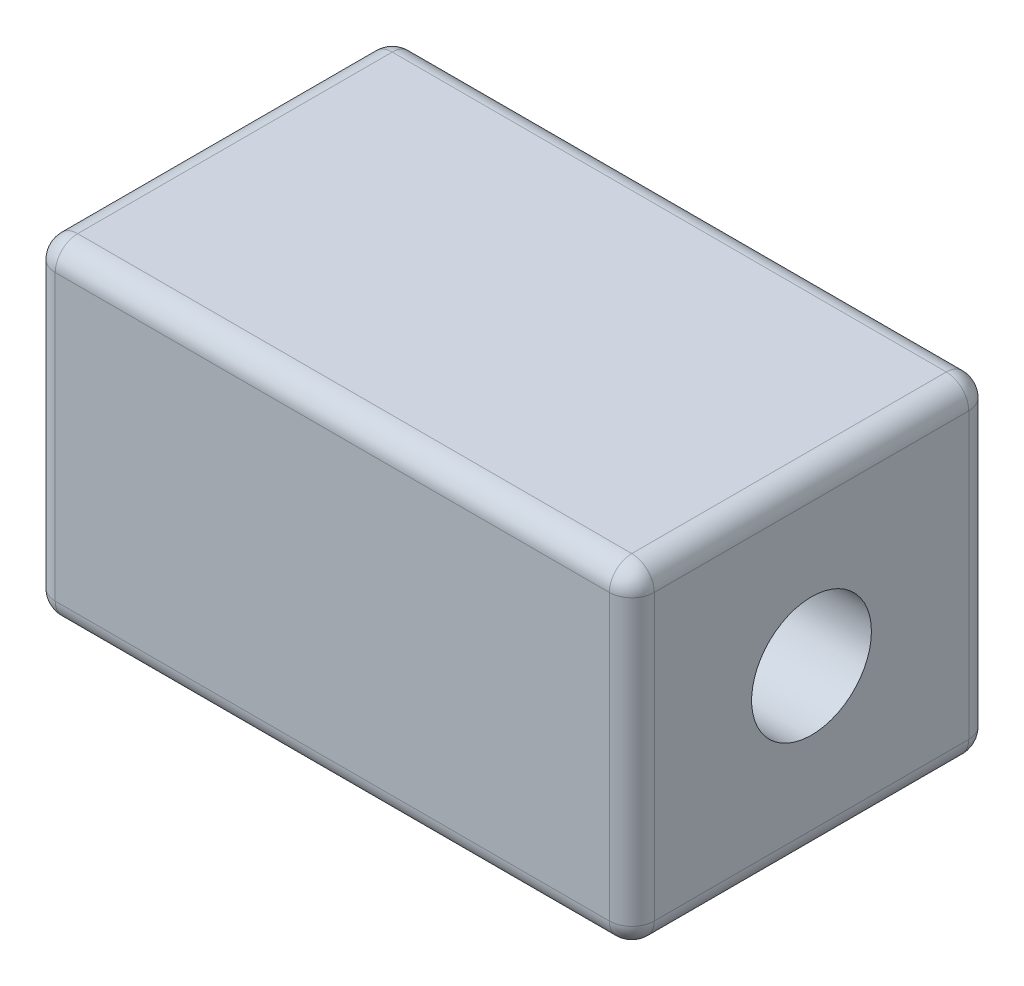
ISO-10303-21;
HEADER;
FILE_DESCRIPTION(('STEP AP214'),'2;1');
FILE_NAME('part.step','',(''),(''),'','','');
FILE_SCHEMA(('AUTOMOTIVE_DESIGN { 1 0 10303 214 1 1 1 1 }'));
ENDSEC;
DATA;
#1=APPLICATION_CONTEXT('core data for automotive mechanical design processes');
#2=APPLICATION_PROTOCOL_DEFINITION('international standard','automotive_design',2000,#1);
#3=PRODUCT_CONTEXT('',#1,'mechanical');
#4=PRODUCT('Part','Part','',(#3));
#5=PRODUCT_RELATED_PRODUCT_CATEGORY('part','',(#4));
#6=PRODUCT_DEFINITION_FORMATION('','',#4);
#7=PRODUCT_DEFINITION_CONTEXT('part definition',#1,'design');
#8=PRODUCT_DEFINITION('design','',#6,#7);
#9=PRODUCT_DEFINITION_SHAPE('','',#8);
#10=(LENGTH_UNIT() NAMED_UNIT(*) SI_UNIT(.MILLI.,.METRE.));
#11=(NAMED_UNIT(*) PLANE_ANGLE_UNIT() SI_UNIT($,.RADIAN.));
#12=(NAMED_UNIT(*) SI_UNIT($,.STERADIAN.) SOLID_ANGLE_UNIT());
#13=UNCERTAINTY_MEASURE_WITH_UNIT(LENGTH_MEASURE(1.E-05),#10,'distance_accuracy_value','');
#14=(GEOMETRIC_REPRESENTATION_CONTEXT(3) GLOBAL_UNCERTAINTY_ASSIGNED_CONTEXT((#13)) GLOBAL_UNIT_ASSIGNED_CONTEXT((#10,
#11,#12)) REPRESENTATION_CONTEXT('',''));
#15=CARTESIAN_POINT('',(0.,0.,0.));
#16=DIRECTION('',(0.,0.,1.));
#17=DIRECTION('',(1.,0.,0.));
#18=AXIS2_PLACEMENT_3D('',#15,#16,#17);
#19=CARTESIAN_POINT('',(9.99999999999995,11.,6.00000000000001));
#20=DIRECTION('',(-1.,0.,0.));
#21=DIRECTION('',(0.,0.,1.));
#22=AXIS2_PLACEMENT_3D('',#19,#20,#21);
#23=PLANE('',#22);
#24=DIRECTION('',(0.,0.,-1.));
#25=VECTOR('',#24,1.);
#26=CARTESIAN_POINT('',(9.99999999999995,10.25,6.00000000000001));
#27=LINE('',#26,#25);
#28=CARTESIAN_POINT('',(9.99999999999995,10.25,-5.24999999999999));
#29=VERTEX_POINT('',#28);
#30=CARTESIAN_POINT('',(9.99999999999995,10.25,5.25000000000001));
#31=VERTEX_POINT('',#30);
#32=EDGE_CURVE('E170',#29,#31,#27,.F.);
#33=ORIENTED_EDGE('',*,*,#32,.T.);
#34=DIRECTION('',(0.,-1.,0.));
#35=VECTOR('',#34,1.);
#36=CARTESIAN_POINT('',(9.99999999999995,11.,5.25000000000001));
#37=LINE('',#36,#35);
#38=CARTESIAN_POINT('',(9.99999999999995,0.750000000000001,5.25000000000001));
#39=VERTEX_POINT('',#38);
#40=EDGE_CURVE('E172',#31,#39,#37,.T.);
#41=ORIENTED_EDGE('',*,*,#40,.T.);
#42=DIRECTION('',(0.,0.,-1.));
#43=VECTOR('',#42,1.);
#44=CARTESIAN_POINT('',(9.99999999999995,0.750000000000001,-5.99999999999999));
#45=LINE('',#44,#43);
#46=CARTESIAN_POINT('',(9.99999999999995,0.750000000000001,-5.24999999999999));
#47=VERTEX_POINT('',#46);
#48=EDGE_CURVE('E166',#39,#47,#45,.T.);
#49=ORIENTED_EDGE('',*,*,#48,.T.);
#50=DIRECTION('',(0.,-1.,0.));
#51=VECTOR('',#50,1.);
#52=CARTESIAN_POINT('',(9.99999999999995,11.,-5.24999999999999));
#53=LINE('',#52,#51);
#54=EDGE_CURVE('E168',#47,#29,#53,.F.);
#55=ORIENTED_EDGE('',*,*,#54,.T.);
#56=EDGE_LOOP('',(#33,#41,#49,#55));
#57=FACE_BOUND('',#56,.T.);
#58=CARTESIAN_POINT('',(9.99999999999995,5.5,0.));
#59=DIRECTION('',(1.,0.,0.));
#60=DIRECTION('',(0.,0.,-1.));
#61=AXIS2_PLACEMENT_3D('',#58,#59,#60);
#62=CIRCLE('',#61,2.);
#63=CARTESIAN_POINT('',(9.99999999999995,5.5,-1.99999999999999));
#64=VERTEX_POINT('',#63);
#65=EDGE_CURVE('E264',#64,#64,#62,.T.);
#66=ORIENTED_EDGE('',*,*,#65,.F.);
#67=EDGE_LOOP('',(#66));
#68=FACE_BOUND('',#67,.T.);
#69=ADVANCED_FACE('F33',(#57,#68),#23,.F.);
#70=CARTESIAN_POINT('',(-10.0000000000001,11.,-5.99999999999999));
#71=DIRECTION('',(0.,0.,1.));
#72=DIRECTION('',(1.,0.,0.));
#73=AXIS2_PLACEMENT_3D('',#70,#71,#72);
#74=PLANE('',#73);
#75=DIRECTION('',(-1.,0.,0.));
#76=VECTOR('',#75,1.);
#77=CARTESIAN_POINT('',(-10.0000000000001,10.25,-5.99999999999999));
#78=LINE('',#77,#76);
#79=CARTESIAN_POINT('',(-9.25000000000006,10.25,-5.99999999999999));
#80=VERTEX_POINT('',#79);
#81=CARTESIAN_POINT('',(9.24999999999995,10.25,-5.99999999999999));
#82=VERTEX_POINT('',#81);
#83=EDGE_CURVE('E42',#80,#82,#78,.F.);
#84=ORIENTED_EDGE('',*,*,#83,.T.);
#85=DIRECTION('',(0.,-1.,0.));
#86=VECTOR('',#85,1.);
#87=CARTESIAN_POINT('',(9.24999999999995,11.,-5.99999999999999));
#88=LINE('',#87,#86);
#89=CARTESIAN_POINT('',(9.24999999999995,0.750000000000001,-5.99999999999999));
#90=VERTEX_POINT('',#89);
#91=EDGE_CURVE('E11',#82,#90,#88,.T.);
#92=ORIENTED_EDGE('',*,*,#91,.T.);
#93=DIRECTION('',(-1.,0.,0.));
#94=VECTOR('',#93,1.);
#95=CARTESIAN_POINT('',(-10.0000000000001,0.750000000000001,-5.99999999999999));
#96=LINE('',#95,#94);
#97=CARTESIAN_POINT('',(-9.25000000000006,0.750000000000001,-5.99999999999999));
#98=VERTEX_POINT('',#97);
#99=EDGE_CURVE('E193',#90,#98,#96,.T.);
#100=ORIENTED_EDGE('',*,*,#99,.T.);
#101=DIRECTION('',(0.,-1.,0.));
#102=VECTOR('',#101,1.);
#103=CARTESIAN_POINT('',(-9.25000000000006,11.,-5.99999999999999));
#104=LINE('',#103,#102);
#105=EDGE_CURVE('E53',#98,#80,#104,.F.);
#106=ORIENTED_EDGE('',*,*,#105,.T.);
#107=EDGE_LOOP('',(#84,#92,#100,#106));
#108=FACE_BOUND('',#107,.T.);
#109=ADVANCED_FACE('F289',(#108),#74,.F.);
#110=CARTESIAN_POINT('',(-10.0000000000001,11.,6.00000000000001));
#111=DIRECTION('',(1.,0.,0.));
#112=DIRECTION('',(0.,0.,-1.));
#113=AXIS2_PLACEMENT_3D('',#110,#111,#112);
#114=PLANE('',#113);
#115=DIRECTION('',(0.,0.,1.));
#116=VECTOR('',#115,1.);
#117=CARTESIAN_POINT('',(-10.0000000000001,0.750000000000001,6.00000000000001));
#118=LINE('',#117,#116);
#119=CARTESIAN_POINT('',(-10.0000000000001,0.750000000000001,-5.24999999999999));
#120=VERTEX_POINT('',#119);
#121=CARTESIAN_POINT('',(-10.0000000000001,0.750000000000001,5.25000000000001));
#122=VERTEX_POINT('',#121);
#123=EDGE_CURVE('E157',#120,#122,#118,.T.);
#124=ORIENTED_EDGE('',*,*,#123,.T.);
#125=DIRECTION('',(0.,-1.,0.));
#126=VECTOR('',#125,1.);
#127=CARTESIAN_POINT('',(-10.0000000000001,11.,5.25000000000001));
#128=LINE('',#127,#126);
#129=CARTESIAN_POINT('',(-10.0000000000001,10.25,5.25000000000001));
#130=VERTEX_POINT('',#129);
#131=EDGE_CURVE('E163',#122,#130,#128,.F.);
#132=ORIENTED_EDGE('',*,*,#131,.T.);
#133=DIRECTION('',(0.,0.,1.));
#134=VECTOR('',#133,1.);
#135=CARTESIAN_POINT('',(-10.0000000000001,10.25,6.00000000000001));
#136=LINE('',#135,#134);
#137=CARTESIAN_POINT('',(-10.0000000000001,10.25,-5.24999999999999));
#138=VERTEX_POINT('',#137);
#139=EDGE_CURVE('E161',#130,#138,#136,.F.);
#140=ORIENTED_EDGE('',*,*,#139,.T.);
#141=DIRECTION('',(0.,-1.,0.));
#142=VECTOR('',#141,1.);
#143=CARTESIAN_POINT('',(-10.0000000000001,11.,-5.24999999999999));
#144=LINE('',#143,#142);
#145=EDGE_CURVE('E159',#138,#120,#144,.T.);
#146=ORIENTED_EDGE('',*,*,#145,.T.);
#147=EDGE_LOOP('',(#124,#132,#140,#146));
#148=FACE_BOUND('',#147,.T.);
#149=CARTESIAN_POINT('',(-10.0000000000001,5.5,0.));
#150=DIRECTION('',(1.,0.,0.));
#151=DIRECTION('',(0.,0.,-1.));
#152=AXIS2_PLACEMENT_3D('',#149,#150,#151);
#153=CIRCLE('',#152,2.);
#154=CARTESIAN_POINT('',(-10.0000000000001,5.5,-1.99999999999999));
#155=VERTEX_POINT('',#154);
#156=EDGE_CURVE('E142',#155,#155,#153,.T.);
#157=ORIENTED_EDGE('',*,*,#156,.T.);
#158=EDGE_LOOP('',(#157));
#159=FACE_BOUND('',#158,.T.);
#160=ADVANCED_FACE('F276',(#148,#159),#114,.F.);
#161=CARTESIAN_POINT('',(-10.0000000000001,11.,6.00000000000001));
#162=DIRECTION('',(0.,0.,-1.));
#163=DIRECTION('',(-1.,0.,0.));
#164=AXIS2_PLACEMENT_3D('',#161,#162,#163);
#165=PLANE('',#164);
#166=DIRECTION('',(0.,-1.,0.));
#167=VECTOR('',#166,1.);
#168=CARTESIAN_POINT('',(-9.25000000000006,11.,6.00000000000001));
#169=LINE('',#168,#167);
#170=CARTESIAN_POINT('',(-9.25000000000006,10.25,6.00000000000001));
#171=VERTEX_POINT('',#170);
#172=CARTESIAN_POINT('',(-9.25000000000006,0.750000000000001,6.00000000000001));
#173=VERTEX_POINT('',#172);
#174=EDGE_CURVE('E152',#171,#173,#169,.T.);
#175=ORIENTED_EDGE('',*,*,#174,.T.);
#176=DIRECTION('',(1.,0.,0.));
#177=VECTOR('',#176,1.);
#178=CARTESIAN_POINT('',(9.99999999999995,0.750000000000001,6.00000000000001));
#179=LINE('',#178,#177);
#180=CARTESIAN_POINT('',(9.24999999999995,0.750000000000001,6.00000000000001));
#181=VERTEX_POINT('',#180);
#182=EDGE_CURVE('E155',#173,#181,#179,.T.);
#183=ORIENTED_EDGE('',*,*,#182,.T.);
#184=DIRECTION('',(0.,-1.,0.));
#185=VECTOR('',#184,1.);
#186=CARTESIAN_POINT('',(9.24999999999995,11.,6.00000000000001));
#187=LINE('',#186,#185);
#188=CARTESIAN_POINT('',(9.24999999999995,10.25,6.00000000000001));
#189=VERTEX_POINT('',#188);
#190=EDGE_CURVE('E150',#181,#189,#187,.F.);
#191=ORIENTED_EDGE('',*,*,#190,.T.);
#192=DIRECTION('',(1.,0.,0.));
#193=VECTOR('',#192,1.);
#194=CARTESIAN_POINT('',(-10.0000000000001,10.25,6.00000000000001));
#195=LINE('',#194,#193);
#196=EDGE_CURVE('E148',#189,#171,#195,.F.);
#197=ORIENTED_EDGE('',*,*,#196,.T.);
#198=EDGE_LOOP('',(#175,#183,#191,#197));
#199=FACE_BOUND('',#198,.T.);
#200=ADVANCED_FACE('F409',(#199),#165,.F.);
#201=CARTESIAN_POINT('',(0.,11.,0.));
#202=DIRECTION('',(0.,-1.,0.));
#203=DIRECTION('',(0.,0.,-1.));
#204=AXIS2_PLACEMENT_3D('',#201,#202,#203);
#205=PLANE('',#204);
#206=DIRECTION('',(0.,0.,1.));
#207=VECTOR('',#206,1.);
#208=CARTESIAN_POINT('',(-9.25000000000006,11.,0.));
#209=LINE('',#208,#207);
#210=CARTESIAN_POINT('',(-9.25000000000006,11.,-5.24999999999999));
#211=VERTEX_POINT('',#210);
#212=CARTESIAN_POINT('',(-9.25000000000006,11.,5.25000000000001));
#213=VERTEX_POINT('',#212);
#214=EDGE_CURVE('E188',#211,#213,#209,.T.);
#215=ORIENTED_EDGE('',*,*,#214,.T.);
#216=DIRECTION('',(1.,0.,0.));
#217=VECTOR('',#216,1.);
#218=CARTESIAN_POINT('',(0.,11.,5.25000000000001));
#219=LINE('',#218,#217);
#220=CARTESIAN_POINT('',(9.24999999999995,11.,5.25000000000001));
#221=VERTEX_POINT('',#220);
#222=EDGE_CURVE('E190',#213,#221,#219,.T.);
#223=ORIENTED_EDGE('',*,*,#222,.T.);
#224=DIRECTION('',(0.,0.,-1.));
#225=VECTOR('',#224,1.);
#226=CARTESIAN_POINT('',(9.24999999999995,11.,0.));
#227=LINE('',#226,#225);
#228=CARTESIAN_POINT('',(9.24999999999995,11.,-5.24999999999999));
#229=VERTEX_POINT('',#228);
#230=EDGE_CURVE('E186',#221,#229,#227,.T.);
#231=ORIENTED_EDGE('',*,*,#230,.T.);
#232=DIRECTION('',(-1.,0.,0.));
#233=VECTOR('',#232,1.);
#234=CARTESIAN_POINT('',(0.,11.,-5.24999999999999));
#235=LINE('',#234,#233);
#236=EDGE_CURVE('E184',#229,#211,#235,.T.);
#237=ORIENTED_EDGE('',*,*,#236,.T.);
#238=EDGE_LOOP('',(#215,#223,#231,#237));
#239=FACE_BOUND('',#238,.T.);
#240=ADVANCED_FACE('F404',(#239),#205,.F.);
#241=CARTESIAN_POINT('',(0.,0.,0.));
#242=DIRECTION('',(0.,-1.,0.));
#243=DIRECTION('',(0.,0.,-1.));
#244=AXIS2_PLACEMENT_3D('',#241,#242,#243);
#245=PLANE('',#244);
#246=DIRECTION('',(-1.,0.,0.));
#247=VECTOR('',#246,1.);
#248=CARTESIAN_POINT('',(9.99999999999995,0.,-5.24999999999999));
#249=LINE('',#248,#247);
#250=CARTESIAN_POINT('',(-9.25000000000006,0.,-5.24999999999999));
#251=VERTEX_POINT('',#250);
#252=CARTESIAN_POINT('',(9.24999999999995,0.,-5.24999999999999));
#253=VERTEX_POINT('',#252);
#254=EDGE_CURVE('E177',#251,#253,#249,.F.);
#255=ORIENTED_EDGE('',*,*,#254,.T.);
#256=DIRECTION('',(0.,0.,-1.));
#257=VECTOR('',#256,1.);
#258=CARTESIAN_POINT('',(9.24999999999995,0.,6.00000000000001));
#259=LINE('',#258,#257);
#260=CARTESIAN_POINT('',(9.24999999999995,0.,5.25000000000001));
#261=VERTEX_POINT('',#260);
#262=EDGE_CURVE('E182',#253,#261,#259,.F.);
#263=ORIENTED_EDGE('',*,*,#262,.T.);
#264=DIRECTION('',(1.,0.,0.));
#265=VECTOR('',#264,1.);
#266=CARTESIAN_POINT('',(-10.0000000000001,0.,5.25000000000001));
#267=LINE('',#266,#265);
#268=CARTESIAN_POINT('',(-9.25000000000006,0.,5.25000000000001));
#269=VERTEX_POINT('',#268);
#270=EDGE_CURVE('E179',#261,#269,#267,.F.);
#271=ORIENTED_EDGE('',*,*,#270,.T.);
#272=DIRECTION('',(0.,0.,1.));
#273=VECTOR('',#272,1.);
#274=CARTESIAN_POINT('',(-9.25000000000006,0.,-5.99999999999999));
#275=LINE('',#274,#273);
#276=EDGE_CURVE('E175',#269,#251,#275,.F.);
#277=ORIENTED_EDGE('',*,*,#276,.T.);
#278=EDGE_LOOP('',(#255,#263,#271,#277));
#279=FACE_BOUND('',#278,.T.);
#280=CARTESIAN_POINT('',(4.99999999999994,0.,-3.));
#281=DIRECTION('',(0.,-1.,0.));
#282=DIRECTION('',(0.,0.,-1.));
#283=AXIS2_PLACEMENT_3D('',#280,#281,#282);
#284=CIRCLE('',#283,0.749999999999996);
#285=CARTESIAN_POINT('',(4.99999999999994,0.,-3.75));
#286=VERTEX_POINT('',#285);
#287=EDGE_CURVE('E136',#286,#286,#284,.T.);
#288=ORIENTED_EDGE('',*,*,#287,.F.);
#289=EDGE_LOOP('',(#288));
#290=FACE_BOUND('',#289,.T.);
#291=CARTESIAN_POINT('',(-5.00000000000006,0.,3.));
#292=DIRECTION('',(0.,-1.,0.));
#293=DIRECTION('',(0.,0.,-1.));
#294=AXIS2_PLACEMENT_3D('',#291,#292,#293);
#295=CIRCLE('',#294,0.749999999999996);
#296=CARTESIAN_POINT('',(-5.00000000000006,0.,2.25));
#297=VERTEX_POINT('',#296);
#298=EDGE_CURVE('E135',#297,#297,#295,.T.);
#299=ORIENTED_EDGE('',*,*,#298,.F.);
#300=EDGE_LOOP('',(#299));
#301=FACE_BOUND('',#300,.T.);
#302=ADVANCED_FACE('F415',(#279,#290,#301),#245,.T.);
#303=CARTESIAN_POINT('',(-5.00000000000006,5.4,3.));
#304=DIRECTION('',(0.,-1.,0.));
#305=DIRECTION('',(0.,0.,-1.));
#306=AXIS2_PLACEMENT_3D('',#303,#304,#305);
#307=CONICAL_SURFACE('',#306,0.749999999999997,1.02974425867665);
#308=CARTESIAN_POINT('',(-5.00000000000007,5.85064546427067,3.));
#309=VERTEX_POINT('',#308);
#310=VERTEX_LOOP('',#309);
#311=FACE_BOUND('',#310,.T.);
#312=CARTESIAN_POINT('',(-5.00000000000006,5.4,3.));
#313=DIRECTION('',(0.,-1.,0.));
#314=DIRECTION('',(0.,0.,-1.));
#315=AXIS2_PLACEMENT_3D('',#312,#313,#314);
#316=CIRCLE('',#315,0.749999999999997);
#317=CARTESIAN_POINT('',(-5.00000000000006,5.4,2.25));
#318=VERTEX_POINT('',#317);
#319=EDGE_CURVE('E139',#318,#318,#316,.T.);
#320=ORIENTED_EDGE('',*,*,#319,.T.);
#321=EDGE_LOOP('',(#320));
#322=FACE_BOUND('',#321,.T.);
#323=ADVANCED_FACE('F418',(#311,#322),#307,.F.);
#324=CARTESIAN_POINT('',(-5.00000000000006,0.,3.));
#325=DIRECTION('',(0.,-1.,0.));
#326=DIRECTION('',(0.,0.,-1.));
#327=AXIS2_PLACEMENT_3D('',#324,#325,#326);
#328=CYLINDRICAL_SURFACE('',#327,0.749999999999997);
#329=ORIENTED_EDGE('',*,*,#319,.F.);
#330=EDGE_LOOP('',(#329));
#331=FACE_BOUND('',#330,.T.);
#332=ORIENTED_EDGE('',*,*,#298,.T.);
#333=EDGE_LOOP('',(#332));
#334=FACE_BOUND('',#333,.T.);
#335=ADVANCED_FACE('F129',(#331,#334),#328,.F.);
#336=CARTESIAN_POINT('',(4.99999999999994,5.4,-3.));
#337=DIRECTION('',(0.,-1.,0.));
#338=DIRECTION('',(0.,0.,-1.));
#339=AXIS2_PLACEMENT_3D('',#336,#337,#338);
#340=CONICAL_SURFACE('',#339,0.749999999999997,1.02974425867665);
#341=CARTESIAN_POINT('',(4.99999999999993,5.85064546427067,-3.));
#342=VERTEX_POINT('',#341);
#343=VERTEX_LOOP('',#342);
#344=FACE_BOUND('',#343,.T.);
#345=CARTESIAN_POINT('',(4.99999999999994,5.4,-3.));
#346=DIRECTION('',(0.,-1.,0.));
#347=DIRECTION('',(0.,0.,-1.));
#348=AXIS2_PLACEMENT_3D('',#345,#346,#347);
#349=CIRCLE('',#348,0.749999999999997);
#350=CARTESIAN_POINT('',(4.99999999999994,5.4,-3.75));
#351=VERTEX_POINT('',#350);
#352=EDGE_CURVE('E133',#351,#351,#349,.T.);
#353=ORIENTED_EDGE('',*,*,#352,.T.);
#354=EDGE_LOOP('',(#353));
#355=FACE_BOUND('',#354,.T.);
#356=ADVANCED_FACE('F125',(#344,#355),#340,.F.);
#357=CARTESIAN_POINT('',(4.99999999999994,0.,-3.));
#358=DIRECTION('',(0.,-1.,0.));
#359=DIRECTION('',(0.,0.,-1.));
#360=AXIS2_PLACEMENT_3D('',#357,#358,#359);
#361=CYLINDRICAL_SURFACE('',#360,0.749999999999997);
#362=ORIENTED_EDGE('',*,*,#352,.F.);
#363=EDGE_LOOP('',(#362));
#364=FACE_BOUND('',#363,.T.);
#365=ORIENTED_EDGE('',*,*,#287,.T.);
#366=EDGE_LOOP('',(#365));
#367=FACE_BOUND('',#366,.T.);
#368=ADVANCED_FACE('F128',(#364,#367),#361,.F.);
#369=CARTESIAN_POINT('',(-10.0000000000001,5.5,0.));
#370=DIRECTION('',(1.,0.,0.));
#371=DIRECTION('',(0.,0.,-1.));
#372=AXIS2_PLACEMENT_3D('',#369,#370,#371);
#373=CYLINDRICAL_SURFACE('',#372,2.);
#374=ORIENTED_EDGE('',*,*,#156,.F.);
#375=EDGE_LOOP('',(#374));
#376=FACE_BOUND('',#375,.T.);
#377=ORIENTED_EDGE('',*,*,#65,.T.);
#378=EDGE_LOOP('',(#377));
#379=FACE_BOUND('',#378,.T.);
#380=ADVANCED_FACE('F278',(#376,#379),#373,.F.);
#381=CARTESIAN_POINT('',(9.24999999999995,11.,-5.24999999999999));
#382=DIRECTION('',(0.,-1.,0.));
#383=DIRECTION('',(0.,0.,-1.));
#384=AXIS2_PLACEMENT_3D('',#381,#382,#383);
#385=CYLINDRICAL_SURFACE('',#384,0.75);
#386=CARTESIAN_POINT('',(9.24999999999995,10.25,-5.24999999999999));
#387=DIRECTION('',(0.,1.,0.));
#388=DIRECTION('',(0.,0.,1.));
#389=AXIS2_PLACEMENT_3D('',#386,#387,#388);
#390=CIRCLE('',#389,0.75);
#391=EDGE_CURVE('E37',#29,#82,#390,.T.);
#392=ORIENTED_EDGE('',*,*,#391,.F.);
#393=ORIENTED_EDGE('',*,*,#54,.F.);
#394=CARTESIAN_POINT('',(9.24999999999995,0.750000000000001,-5.24999999999999));
#395=DIRECTION('',(0.,-1.,0.));
#396=DIRECTION('',(0.,0.,-1.));
#397=AXIS2_PLACEMENT_3D('',#394,#395,#396);
#398=CIRCLE('',#397,0.75);
#399=EDGE_CURVE('E257',#90,#47,#398,.T.);
#400=ORIENTED_EDGE('',*,*,#399,.F.);
#401=ORIENTED_EDGE('',*,*,#91,.F.);
#402=EDGE_LOOP('',(#392,#393,#400,#401));
#403=FACE_BOUND('',#402,.T.);
#404=ADVANCED_FACE('F35',(#403),#385,.T.);
#405=CARTESIAN_POINT('',(9.24999999999995,10.25,-5.24999999999999));
#406=DIRECTION('',(0.,0.,1.));
#407=DIRECTION('',(1.,0.,0.));
#408=AXIS2_PLACEMENT_3D('',#405,#406,#407);
#409=SPHERICAL_SURFACE('',#408,0.75);
#410=CARTESIAN_POINT('',(9.24999999999995,10.25,-5.24999999999999));
#411=DIRECTION('',(0.,0.,-1.));
#412=DIRECTION('',(-1.,0.,0.));
#413=AXIS2_PLACEMENT_3D('',#410,#411,#412);
#414=CIRCLE('',#413,0.75);
#415=EDGE_CURVE('E252',#29,#229,#414,.F.);
#416=ORIENTED_EDGE('',*,*,#415,.F.);
#417=ORIENTED_EDGE('',*,*,#391,.T.);
#418=CARTESIAN_POINT('',(9.24999999999995,10.25,-5.24999999999999));
#419=DIRECTION('',(1.,0.,0.));
#420=DIRECTION('',(0.,0.,-1.));
#421=AXIS2_PLACEMENT_3D('',#418,#419,#420);
#422=CIRCLE('',#421,0.75);
#423=EDGE_CURVE('E255',#229,#82,#422,.F.);
#424=ORIENTED_EDGE('',*,*,#423,.F.);
#425=EDGE_LOOP('',(#416,#417,#424));
#426=FACE_BOUND('',#425,.T.);
#427=ADVANCED_FACE('F285',(#426),#409,.T.);
#428=CARTESIAN_POINT('',(9.24999999999995,0.75,-5.24999999999999));
#429=DIRECTION('',(0.,0.,1.));
#430=DIRECTION('',(1.,0.,0.));
#431=AXIS2_PLACEMENT_3D('',#428,#429,#430);
#432=SPHERICAL_SURFACE('',#431,0.75);
#433=CARTESIAN_POINT('',(9.24999999999995,0.75,-5.24999999999999));
#434=DIRECTION('',(1.,0.,0.));
#435=DIRECTION('',(0.,0.,-1.));
#436=AXIS2_PLACEMENT_3D('',#433,#434,#435);
#437=CIRCLE('',#436,0.75);
#438=EDGE_CURVE('E246',#90,#253,#437,.F.);
#439=ORIENTED_EDGE('',*,*,#438,.F.);
#440=ORIENTED_EDGE('',*,*,#399,.T.);
#441=CARTESIAN_POINT('',(9.24999999999995,0.750000000000001,-5.24999999999999));
#442=DIRECTION('',(0.,0.,-1.));
#443=DIRECTION('',(-1.,0.,0.));
#444=AXIS2_PLACEMENT_3D('',#441,#442,#443);
#445=CIRCLE('',#444,0.75);
#446=EDGE_CURVE('E249',#253,#47,#445,.F.);
#447=ORIENTED_EDGE('',*,*,#446,.F.);
#448=EDGE_LOOP('',(#439,#440,#447));
#449=FACE_BOUND('',#448,.T.);
#450=ADVANCED_FACE('F366',(#449),#432,.T.);
#451=CARTESIAN_POINT('',(0.,10.25,-5.24999999999999));
#452=DIRECTION('',(-1.,0.,0.));
#453=DIRECTION('',(0.,0.,1.));
#454=AXIS2_PLACEMENT_3D('',#451,#452,#453);
#455=CYLINDRICAL_SURFACE('',#454,0.75);
#456=ORIENTED_EDGE('',*,*,#423,.T.);
#457=ORIENTED_EDGE('',*,*,#83,.F.);
#458=CARTESIAN_POINT('',(-9.25000000000006,10.25,-5.24999999999999));
#459=DIRECTION('',(-1.,0.,0.));
#460=DIRECTION('',(0.,0.,1.));
#461=AXIS2_PLACEMENT_3D('',#458,#459,#460);
#462=CIRCLE('',#461,0.75);
#463=EDGE_CURVE('E240',#211,#80,#462,.T.);
#464=ORIENTED_EDGE('',*,*,#463,.F.);
#465=ORIENTED_EDGE('',*,*,#236,.F.);
#466=EDGE_LOOP('',(#456,#457,#464,#465));
#467=FACE_BOUND('',#466,.T.);
#468=ADVANCED_FACE('F362',(#467),#455,.T.);
#469=CARTESIAN_POINT('',(9.24999999999995,10.25,0.));
#470=DIRECTION('',(0.,0.,-1.));
#471=DIRECTION('',(-1.,0.,0.));
#472=AXIS2_PLACEMENT_3D('',#469,#470,#471);
#473=CYLINDRICAL_SURFACE('',#472,0.75);
#474=ORIENTED_EDGE('',*,*,#415,.T.);
#475=ORIENTED_EDGE('',*,*,#230,.F.);
#476=CARTESIAN_POINT('',(9.24999999999995,10.25,5.25000000000001));
#477=DIRECTION('',(0.,0.,1.));
#478=DIRECTION('',(1.,0.,0.));
#479=AXIS2_PLACEMENT_3D('',#476,#477,#478);
#480=CIRCLE('',#479,0.75);
#481=EDGE_CURVE('E237',#31,#221,#480,.T.);
#482=ORIENTED_EDGE('',*,*,#481,.F.);
#483=ORIENTED_EDGE('',*,*,#32,.F.);
#484=EDGE_LOOP('',(#474,#475,#482,#483));
#485=FACE_BOUND('',#484,.T.);
#486=ADVANCED_FACE('F358',(#485),#473,.T.);
#487=CARTESIAN_POINT('',(9.24999999999995,11.,5.25000000000001));
#488=DIRECTION('',(0.,-1.,0.));
#489=DIRECTION('',(0.,0.,-1.));
#490=AXIS2_PLACEMENT_3D('',#487,#488,#489);
#491=CYLINDRICAL_SURFACE('',#490,0.75);
#492=CARTESIAN_POINT('',(9.24999999999995,0.750000000000001,5.25000000000001));
#493=DIRECTION('',(0.,-1.,0.));
#494=DIRECTION('',(0.,0.,-1.));
#495=AXIS2_PLACEMENT_3D('',#492,#493,#494);
#496=CIRCLE('',#495,0.75);
#497=EDGE_CURVE('E231',#39,#181,#496,.T.);
#498=ORIENTED_EDGE('',*,*,#497,.F.);
#499=ORIENTED_EDGE('',*,*,#40,.F.);
#500=CARTESIAN_POINT('',(9.24999999999995,10.25,5.25000000000001));
#501=DIRECTION('',(0.,1.,0.));
#502=DIRECTION('',(0.,0.,1.));
#503=AXIS2_PLACEMENT_3D('',#500,#501,#502);
#504=CIRCLE('',#503,0.75);
#505=EDGE_CURVE('E234',#189,#31,#504,.T.);
#506=ORIENTED_EDGE('',*,*,#505,.F.);
#507=ORIENTED_EDGE('',*,*,#190,.F.);
#508=EDGE_LOOP('',(#498,#499,#506,#507));
#509=FACE_BOUND('',#508,.T.);
#510=ADVANCED_FACE('F354',(#509),#491,.T.);
#511=CARTESIAN_POINT('',(9.24999999999995,0.750000000000001,6.00000000000001));
#512=DIRECTION('',(0.,0.,1.));
#513=DIRECTION('',(1.,0.,0.));
#514=AXIS2_PLACEMENT_3D('',#511,#512,#513);
#515=CYLINDRICAL_SURFACE('',#514,0.75);
#516=ORIENTED_EDGE('',*,*,#446,.T.);
#517=ORIENTED_EDGE('',*,*,#48,.F.);
#518=CARTESIAN_POINT('',(9.24999999999995,0.75,5.25000000000001));
#519=DIRECTION('',(0.,0.,1.));
#520=DIRECTION('',(1.,0.,0.));
#521=AXIS2_PLACEMENT_3D('',#518,#519,#520);
#522=CIRCLE('',#521,0.75);
#523=EDGE_CURVE('E229',#261,#39,#522,.T.);
#524=ORIENTED_EDGE('',*,*,#523,.F.);
#525=ORIENTED_EDGE('',*,*,#262,.F.);
#526=EDGE_LOOP('',(#516,#517,#524,#525));
#527=FACE_BOUND('',#526,.T.);
#528=ADVANCED_FACE('F350',(#527),#515,.T.);
#529=CARTESIAN_POINT('',(-10.0000000000001,0.750000000000001,-5.24999999999999));
#530=DIRECTION('',(1.,0.,0.));
#531=DIRECTION('',(0.,0.,-1.));
#532=AXIS2_PLACEMENT_3D('',#529,#530,#531);
#533=CYLINDRICAL_SURFACE('',#532,0.75);
#534=ORIENTED_EDGE('',*,*,#438,.T.);
#535=ORIENTED_EDGE('',*,*,#254,.F.);
#536=CARTESIAN_POINT('',(-9.25000000000006,0.750000000000001,-5.24999999999999));
#537=DIRECTION('',(-1.,0.,0.));
#538=DIRECTION('',(0.,0.,1.));
#539=AXIS2_PLACEMENT_3D('',#536,#537,#538);
#540=CIRCLE('',#539,0.75);
#541=EDGE_CURVE('E226',#98,#251,#540,.T.);
#542=ORIENTED_EDGE('',*,*,#541,.F.);
#543=ORIENTED_EDGE('',*,*,#99,.F.);
#544=EDGE_LOOP('',(#534,#535,#542,#543));
#545=FACE_BOUND('',#544,.T.);
#546=ADVANCED_FACE('F346',(#545),#533,.T.);
#547=CARTESIAN_POINT('',(-9.25000000000006,11.,-5.24999999999999));
#548=DIRECTION('',(0.,-1.,0.));
#549=DIRECTION('',(0.,0.,-1.));
#550=AXIS2_PLACEMENT_3D('',#547,#548,#549);
#551=CYLINDRICAL_SURFACE('',#550,0.75);
#552=CARTESIAN_POINT('',(-9.25000000000006,10.25,-5.24999999999999));
#553=DIRECTION('',(0.,1.,0.));
#554=DIRECTION('',(0.,0.,1.));
#555=AXIS2_PLACEMENT_3D('',#552,#553,#554);
#556=CIRCLE('',#555,0.75);
#557=EDGE_CURVE('E243',#80,#138,#556,.T.);
#558=ORIENTED_EDGE('',*,*,#557,.F.);
#559=ORIENTED_EDGE('',*,*,#105,.F.);
#560=CARTESIAN_POINT('',(-9.25000000000006,0.750000000000001,-5.24999999999999));
#561=DIRECTION('',(0.,-1.,0.));
#562=DIRECTION('',(0.,0.,-1.));
#563=AXIS2_PLACEMENT_3D('',#560,#561,#562);
#564=CIRCLE('',#563,0.75);
#565=EDGE_CURVE('E223',#120,#98,#564,.T.);
#566=ORIENTED_EDGE('',*,*,#565,.F.);
#567=ORIENTED_EDGE('',*,*,#145,.F.);
#568=EDGE_LOOP('',(#558,#559,#566,#567));
#569=FACE_BOUND('',#568,.T.);
#570=ADVANCED_FACE('F342',(#569),#551,.T.);
#571=CARTESIAN_POINT('',(-9.25000000000006,10.25,-5.24999999999999));
#572=DIRECTION('',(0.,0.,1.));
#573=DIRECTION('',(1.,0.,0.));
#574=AXIS2_PLACEMENT_3D('',#571,#572,#573);
#575=SPHERICAL_SURFACE('',#574,0.75);
#576=ORIENTED_EDGE('',*,*,#463,.T.);
#577=ORIENTED_EDGE('',*,*,#557,.T.);
#578=CARTESIAN_POINT('',(-9.25000000000006,10.25,-5.24999999999999));
#579=DIRECTION('',(0.,0.,-1.));
#580=DIRECTION('',(0.,1.,0.));
#581=AXIS2_PLACEMENT_3D('',#578,#579,#580);
#582=CIRCLE('',#581,0.75);
#583=EDGE_CURVE('E220',#211,#138,#582,.F.);
#584=ORIENTED_EDGE('',*,*,#583,.F.);
#585=EDGE_LOOP('',(#576,#577,#584));
#586=FACE_BOUND('',#585,.T.);
#587=ADVANCED_FACE('F338',(#586),#575,.T.);
#588=CARTESIAN_POINT('',(9.24999999999995,10.25,5.25000000000001));
#589=DIRECTION('',(0.,0.,1.));
#590=DIRECTION('',(1.,0.,0.));
#591=AXIS2_PLACEMENT_3D('',#588,#589,#590);
#592=SPHERICAL_SURFACE('',#591,0.75);
#593=ORIENTED_EDGE('',*,*,#505,.T.);
#594=ORIENTED_EDGE('',*,*,#481,.T.);
#595=CARTESIAN_POINT('',(9.24999999999995,10.25,5.25000000000001));
#596=DIRECTION('',(1.,0.,0.));
#597=DIRECTION('',(0.,0.,-1.));
#598=AXIS2_PLACEMENT_3D('',#595,#596,#597);
#599=CIRCLE('',#598,0.75);
#600=EDGE_CURVE('E218',#189,#221,#599,.F.);
#601=ORIENTED_EDGE('',*,*,#600,.F.);
#602=EDGE_LOOP('',(#593,#594,#601));
#603=FACE_BOUND('',#602,.T.);
#604=ADVANCED_FACE('F334',(#603),#592,.T.);
#605=CARTESIAN_POINT('',(9.24999999999995,0.75,5.25000000000001));
#606=DIRECTION('',(0.,0.,1.));
#607=DIRECTION('',(1.,0.,0.));
#608=AXIS2_PLACEMENT_3D('',#605,#606,#607);
#609=SPHERICAL_SURFACE('',#608,0.75);
#610=ORIENTED_EDGE('',*,*,#523,.T.);
#611=ORIENTED_EDGE('',*,*,#497,.T.);
#612=CARTESIAN_POINT('',(9.24999999999995,0.750000000000001,5.25000000000001));
#613=DIRECTION('',(1.,0.,0.));
#614=DIRECTION('',(0.,0.,-1.));
#615=AXIS2_PLACEMENT_3D('',#612,#613,#614);
#616=CIRCLE('',#615,0.75);
#617=EDGE_CURVE('E215',#261,#181,#616,.F.);
#618=ORIENTED_EDGE('',*,*,#617,.F.);
#619=EDGE_LOOP('',(#610,#611,#618));
#620=FACE_BOUND('',#619,.T.);
#621=ADVANCED_FACE('F330',(#620),#609,.T.);
#622=CARTESIAN_POINT('',(-9.25000000000006,0.75,-5.24999999999999));
#623=DIRECTION('',(0.,0.,1.));
#624=DIRECTION('',(1.,0.,0.));
#625=AXIS2_PLACEMENT_3D('',#622,#623,#624);
#626=SPHERICAL_SURFACE('',#625,0.75);
#627=ORIENTED_EDGE('',*,*,#565,.T.);
#628=ORIENTED_EDGE('',*,*,#541,.T.);
#629=CARTESIAN_POINT('',(-9.25000000000006,0.75,-5.24999999999999));
#630=DIRECTION('',(0.,0.,-1.));
#631=DIRECTION('',(-1.,0.,0.));
#632=AXIS2_PLACEMENT_3D('',#629,#630,#631);
#633=CIRCLE('',#632,0.75);
#634=EDGE_CURVE('E212',#120,#251,#633,.F.);
#635=ORIENTED_EDGE('',*,*,#634,.F.);
#636=EDGE_LOOP('',(#627,#628,#635));
#637=FACE_BOUND('',#636,.T.);
#638=ADVANCED_FACE('F326',(#637),#626,.T.);
#639=CARTESIAN_POINT('',(-9.25000000000006,10.25,0.));
#640=DIRECTION('',(0.,0.,1.));
#641=DIRECTION('',(1.,0.,0.));
#642=AXIS2_PLACEMENT_3D('',#639,#640,#641);
#643=CYLINDRICAL_SURFACE('',#642,0.75);
#644=ORIENTED_EDGE('',*,*,#583,.T.);
#645=ORIENTED_EDGE('',*,*,#139,.F.);
#646=CARTESIAN_POINT('',(-9.25000000000006,10.25,5.25000000000001));
#647=DIRECTION('',(0.,0.,1.));
#648=DIRECTION('',(1.,0.,0.));
#649=AXIS2_PLACEMENT_3D('',#646,#647,#648);
#650=CIRCLE('',#649,0.75);
#651=EDGE_CURVE('E209',#213,#130,#650,.T.);
#652=ORIENTED_EDGE('',*,*,#651,.F.);
#653=ORIENTED_EDGE('',*,*,#214,.F.);
#654=EDGE_LOOP('',(#644,#645,#652,#653));
#655=FACE_BOUND('',#654,.T.);
#656=ADVANCED_FACE('F322',(#655),#643,.T.);
#657=CARTESIAN_POINT('',(0.,10.25,5.25000000000001));
#658=DIRECTION('',(1.,0.,0.));
#659=DIRECTION('',(0.,0.,-1.));
#660=AXIS2_PLACEMENT_3D('',#657,#658,#659);
#661=CYLINDRICAL_SURFACE('',#660,0.75);
#662=ORIENTED_EDGE('',*,*,#600,.T.);
#663=ORIENTED_EDGE('',*,*,#222,.F.);
#664=CARTESIAN_POINT('',(-9.25000000000006,10.25,5.25000000000001));
#665=DIRECTION('',(-1.,0.,0.));
#666=DIRECTION('',(0.,0.,1.));
#667=AXIS2_PLACEMENT_3D('',#664,#665,#666);
#668=CIRCLE('',#667,0.75);
#669=EDGE_CURVE('E206',#171,#213,#668,.T.);
#670=ORIENTED_EDGE('',*,*,#669,.F.);
#671=ORIENTED_EDGE('',*,*,#196,.F.);
#672=EDGE_LOOP('',(#662,#663,#670,#671));
#673=FACE_BOUND('',#672,.T.);
#674=ADVANCED_FACE('F318',(#673),#661,.T.);
#675=CARTESIAN_POINT('',(-10.0000000000001,0.750000000000001,5.25000000000001));
#676=DIRECTION('',(-1.,0.,0.));
#677=DIRECTION('',(0.,0.,1.));
#678=AXIS2_PLACEMENT_3D('',#675,#676,#677);
#679=CYLINDRICAL_SURFACE('',#678,0.75);
#680=ORIENTED_EDGE('',*,*,#617,.T.);
#681=ORIENTED_EDGE('',*,*,#182,.F.);
#682=CARTESIAN_POINT('',(-9.25000000000006,0.75,5.25000000000001));
#683=DIRECTION('',(-1.,0.,0.));
#684=DIRECTION('',(0.,0.,1.));
#685=AXIS2_PLACEMENT_3D('',#682,#683,#684);
#686=CIRCLE('',#685,0.75);
#687=EDGE_CURVE('E203',#269,#173,#686,.T.);
#688=ORIENTED_EDGE('',*,*,#687,.F.);
#689=ORIENTED_EDGE('',*,*,#270,.F.);
#690=EDGE_LOOP('',(#680,#681,#688,#689));
#691=FACE_BOUND('',#690,.T.);
#692=ADVANCED_FACE('F314',(#691),#679,.T.);
#693=CARTESIAN_POINT('',(-9.25000000000006,0.750000000000001,6.00000000000001));
#694=DIRECTION('',(0.,0.,-1.));
#695=DIRECTION('',(-1.,0.,0.));
#696=AXIS2_PLACEMENT_3D('',#693,#694,#695);
#697=CYLINDRICAL_SURFACE('',#696,0.75);
#698=ORIENTED_EDGE('',*,*,#634,.T.);
#699=ORIENTED_EDGE('',*,*,#276,.F.);
#700=CARTESIAN_POINT('',(-9.25000000000006,0.750000000000001,5.25000000000001));
#701=DIRECTION('',(0.,0.,1.));
#702=DIRECTION('',(1.,0.,0.));
#703=AXIS2_PLACEMENT_3D('',#700,#701,#702);
#704=CIRCLE('',#703,0.75);
#705=EDGE_CURVE('E201',#122,#269,#704,.T.);
#706=ORIENTED_EDGE('',*,*,#705,.F.);
#707=ORIENTED_EDGE('',*,*,#123,.F.);
#708=EDGE_LOOP('',(#698,#699,#706,#707));
#709=FACE_BOUND('',#708,.T.);
#710=ADVANCED_FACE('F310',(#709),#697,.T.);
#711=CARTESIAN_POINT('',(-9.25000000000006,10.25,5.25000000000001));
#712=DIRECTION('',(0.,0.,1.));
#713=DIRECTION('',(1.,0.,0.));
#714=AXIS2_PLACEMENT_3D('',#711,#712,#713);
#715=SPHERICAL_SURFACE('',#714,0.75);
#716=ORIENTED_EDGE('',*,*,#669,.T.);
#717=ORIENTED_EDGE('',*,*,#651,.T.);
#718=CARTESIAN_POINT('',(-9.25000000000006,10.25,5.25000000000001));
#719=DIRECTION('',(0.,1.,0.));
#720=DIRECTION('',(0.,0.,1.));
#721=AXIS2_PLACEMENT_3D('',#718,#719,#720);
#722=CIRCLE('',#721,0.75);
#723=EDGE_CURVE('E199',#171,#130,#722,.F.);
#724=ORIENTED_EDGE('',*,*,#723,.F.);
#725=EDGE_LOOP('',(#716,#717,#724));
#726=FACE_BOUND('',#725,.T.);
#727=ADVANCED_FACE('F306',(#726),#715,.T.);
#728=CARTESIAN_POINT('',(-9.25000000000006,0.75,5.25000000000001));
#729=DIRECTION('',(0.,0.,1.));
#730=DIRECTION('',(1.,0.,0.));
#731=AXIS2_PLACEMENT_3D('',#728,#729,#730);
#732=SPHERICAL_SURFACE('',#731,0.75);
#733=ORIENTED_EDGE('',*,*,#705,.T.);
#734=ORIENTED_EDGE('',*,*,#687,.T.);
#735=CARTESIAN_POINT('',(-9.25000000000006,0.750000000000001,5.25000000000001));
#736=DIRECTION('',(0.,-1.,0.));
#737=DIRECTION('',(0.,0.,-1.));
#738=AXIS2_PLACEMENT_3D('',#735,#736,#737);
#739=CIRCLE('',#738,0.75);
#740=EDGE_CURVE('E197',#122,#173,#739,.F.);
#741=ORIENTED_EDGE('',*,*,#740,.F.);
#742=EDGE_LOOP('',(#733,#734,#741));
#743=FACE_BOUND('',#742,.T.);
#744=ADVANCED_FACE('F302',(#743),#732,.T.);
#745=CARTESIAN_POINT('',(-9.25000000000006,11.,5.25000000000001));
#746=DIRECTION('',(0.,-1.,0.));
#747=DIRECTION('',(0.,0.,-1.));
#748=AXIS2_PLACEMENT_3D('',#745,#746,#747);
#749=CYLINDRICAL_SURFACE('',#748,0.75);
#750=ORIENTED_EDGE('',*,*,#723,.T.);
#751=ORIENTED_EDGE('',*,*,#131,.F.);
#752=ORIENTED_EDGE('',*,*,#740,.T.);
#753=ORIENTED_EDGE('',*,*,#174,.F.);
#754=EDGE_LOOP('',(#750,#751,#752,#753));
#755=FACE_BOUND('',#754,.T.);
#756=ADVANCED_FACE('F299',(#755),#749,.T.);
#757=CLOSED_SHELL('',(#69,#109,#160,#200,#240,#302,#323,#335,#356,#368,#380,#404,#427,#450,#468,
#486,#510,#528,#546,#570,#587,#604,#621,#638,#656,#674,#692,#710,#727,#744,#756));
#758=MANIFOLD_SOLID_BREP('B2',#757);
#759=ADVANCED_BREP_SHAPE_REPRESENTATION('',(#18,#758),#14);
#760=SHAPE_DEFINITION_REPRESENTATION(#9,#759);
ENDSEC;
END-ISO-10303-21;
